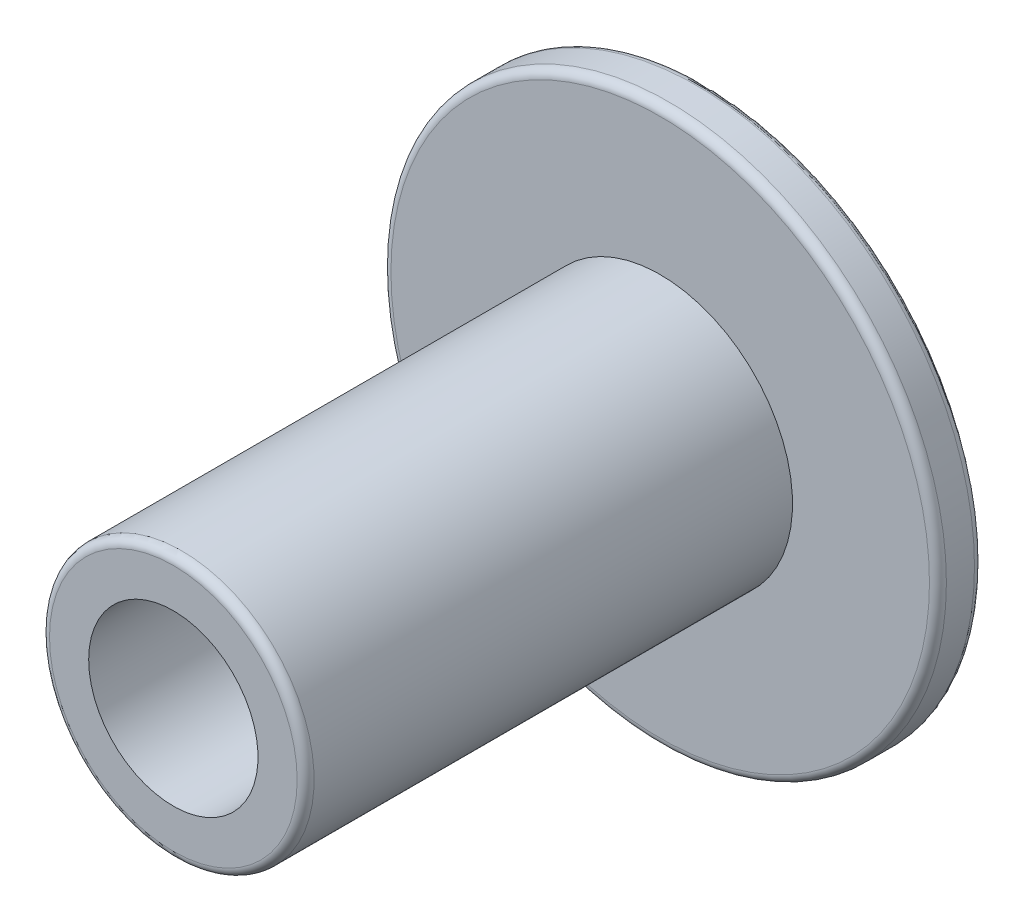
ISO-10303-21;
HEADER;
FILE_DESCRIPTION(('STEP AP214'),'2;1');
FILE_NAME('part.step','',(''),(''),'','','');
FILE_SCHEMA(('AUTOMOTIVE_DESIGN { 1 0 10303 214 1 1 1 1 }'));
ENDSEC;
DATA;
#1=APPLICATION_CONTEXT('core data for automotive mechanical design processes');
#2=APPLICATION_PROTOCOL_DEFINITION('international standard','automotive_design',2000,#1);
#3=PRODUCT_CONTEXT('',#1,'mechanical');
#4=PRODUCT('Part','Part','',(#3));
#5=PRODUCT_RELATED_PRODUCT_CATEGORY('part','',(#4));
#6=PRODUCT_DEFINITION_FORMATION('','',#4);
#7=PRODUCT_DEFINITION_CONTEXT('part definition',#1,'design');
#8=PRODUCT_DEFINITION('design','',#6,#7);
#9=PRODUCT_DEFINITION_SHAPE('','',#8);
#10=(LENGTH_UNIT() NAMED_UNIT(*) SI_UNIT(.MILLI.,.METRE.));
#11=(NAMED_UNIT(*) PLANE_ANGLE_UNIT() SI_UNIT($,.RADIAN.));
#12=(NAMED_UNIT(*) SI_UNIT($,.STERADIAN.) SOLID_ANGLE_UNIT());
#13=UNCERTAINTY_MEASURE_WITH_UNIT(LENGTH_MEASURE(1.E-05),#10,'distance_accuracy_value','');
#14=(GEOMETRIC_REPRESENTATION_CONTEXT(3) GLOBAL_UNCERTAINTY_ASSIGNED_CONTEXT((#13)) GLOBAL_UNIT_ASSIGNED_CONTEXT((#10,
#11,#12)) REPRESENTATION_CONTEXT('',''));
#15=CARTESIAN_POINT('',(0.,0.,0.));
#16=DIRECTION('',(0.,0.,1.));
#17=DIRECTION('',(1.,0.,0.));
#18=AXIS2_PLACEMENT_3D('',#15,#16,#17);
#19=CARTESIAN_POINT('',(4.55191440096314E-12,-6.10622663543836E-13,1.58750000000153));
#20=DIRECTION('',(0.,0.,-1.));
#21=DIRECTION('',(-1.,0.,0.));
#22=AXIS2_PLACEMENT_3D('',#19,#20,#21);
#23=TOROIDAL_SURFACE('',#22,2.24094461987932,1.5875);
#24=CARTESIAN_POINT('',(0.,0.,0.108811457693029));
#25=DIRECTION('',(0.,0.,1.));
#26=DIRECTION('',(1.,0.,0.));
#27=AXIS2_PLACEMENT_3D('',#24,#25,#26);
#28=CIRCLE('',#27,2.81855733169323);
#29=CARTESIAN_POINT('',(2.81855733169323,0.,0.108811457693037));
#30=VERTEX_POINT('',#29);
#31=EDGE_CURVE('E172',#30,#30,#28,.T.);
#32=ORIENTED_EDGE('',*,*,#31,.F.);
#33=EDGE_LOOP('',(#32));
#34=FACE_BOUND('',#33,.T.);
#35=CARTESIAN_POINT('',(4.55632059855483E-12,-6.07273953426408E-13,1.53219451015651E-12));
#36=DIRECTION('',(0.,0.,1.));
#37=DIRECTION('',(-1.,0.,0.));
#38=AXIS2_PLACEMENT_3D('',#35,#36,#37);
#39=CIRCLE('',#38,2.2409446198816);
#40=CARTESIAN_POINT('',(2.24094461988251,-5.23983614090785E-13,1.5465645340414E-12));
#41=VERTEX_POINT('',#40);
#42=CARTESIAN_POINT('',(-2.24094461987705,-3.52297822733429E-13,1.54384375825675E-12));
#43=VERTEX_POINT('',#42);
#44=EDGE_CURVE('E51',#41,#43,#39,.F.);
#45=ORIENTED_EDGE('',*,*,#44,.F.);
#46=CARTESIAN_POINT('',(4.55632059855483E-12,-6.07273953426408E-13,1.53219451015651E-12));
#47=DIRECTION('',(0.,0.,1.));
#48=DIRECTION('',(1.,2.08788882158213E-13,0.));
#49=AXIS2_PLACEMENT_3D('',#46,#47,#48);
#50=CIRCLE('',#49,2.24094461987705);
#51=EDGE_CURVE('E48',#43,#41,#50,.F.);
#52=ORIENTED_EDGE('',*,*,#51,.F.);
#53=EDGE_LOOP('',(#45,#52));
#54=FACE_BOUND('',#53,.T.);
#55=ADVANCED_FACE('F17',(#34,#54),#23,.T.);
#56=CARTESIAN_POINT('',(0.,0.,0.603441022263939));
#57=DIRECTION('',(0.,0.,1.));
#58=DIRECTION('',(1.,0.,0.));
#59=AXIS2_PLACEMENT_3D('',#56,#57,#58);
#60=CONICAL_SURFACE('',#59,4.08480901694475,1.19839788010476);
#61=ORIENTED_EDGE('',*,*,#31,.T.);
#62=EDGE_LOOP('',(#61));
#63=FACE_BOUND('',#62,.T.);
#64=CARTESIAN_POINT('',(3.55304201361089E-12,-2.83081917834214E-12,0.60344102225023));
#65=DIRECTION('',(0.,0.,1.));
#66=DIRECTION('',(1.,0.,0.));
#67=AXIS2_PLACEMENT_3D('',#64,#65,#66);
#68=CIRCLE('',#67,4.0848090169564);
#69=CARTESIAN_POINT('',(4.08480901695995,-2.85281416609798E-12,0.603441022250242));
#70=VERTEX_POINT('',#69);
#71=EDGE_CURVE('E160',#70,#70,#68,.T.);
#72=ORIENTED_EDGE('',*,*,#71,.F.);
#73=EDGE_LOOP('',(#72));
#74=FACE_BOUND('',#73,.T.);
#75=ADVANCED_FACE('F261',(#63,#74),#60,.T.);
#76=CARTESIAN_POINT('',(-1.26999999999694,-1.19348975147204E-12,1.56819002228303E-12));
#77=DIRECTION('',(0.,0.,-1.));
#78=DIRECTION('',(-1.,0.,0.));
#79=AXIS2_PLACEMENT_3D('',#76,#77,#78);
#80=PLANE('',#79);
#81=CARTESIAN_POINT('',(4.99177482609008E-12,-8.6474694213188E-13,0.));
#82=DIRECTION('',(0.,0.,-1.));
#83=DIRECTION('',(-1.,0.,0.));
#84=AXIS2_PLACEMENT_3D('',#81,#82,#83);
#85=CIRCLE('',#84,1.27);
#86=CARTESIAN_POINT('',(-1.26999999999501,-8.6474694213188E-13,0.));
#87=VERTEX_POINT('',#86);
#88=EDGE_CURVE('E145',#87,#87,#85,.F.);
#89=ORIENTED_EDGE('',*,*,#88,.T.);
#90=EDGE_LOOP('',(#89));
#91=FACE_BOUND('',#90,.T.);
#92=ORIENTED_EDGE('',*,*,#51,.T.);
#93=ORIENTED_EDGE('',*,*,#44,.T.);
#94=EDGE_LOOP('',(#92,#93));
#95=FACE_BOUND('',#94,.T.);
#96=ADVANCED_FACE('F136',(#91,#95),#80,.T.);
#97=CARTESIAN_POINT('',(3.5527136788005E-12,-2.83106871279415E-12,0.721736105630408));
#98=DIRECTION('',(0.,0.,1.));
#99=DIRECTION('',(1.,0.,0.));
#100=AXIS2_PLACEMENT_3D('',#97,#98,#99);
#101=TOROIDAL_SURFACE('',#100,4.0386,0.127);
#102=ORIENTED_EDGE('',*,*,#71,.T.);
#103=EDGE_LOOP('',(#102));
#104=FACE_BOUND('',#103,.T.);
#105=CARTESIAN_POINT('',(4.9897716060016E-12,-8.66269389375368E-13,0.721736105630408));
#106=DIRECTION('',(0.,0.,-1.));
#107=DIRECTION('',(-1.,0.,0.));
#108=AXIS2_PLACEMENT_3D('',#105,#106,#107);
#109=CIRCLE('',#108,4.16560000000001);
#110=CARTESIAN_POINT('',(-4.16559999999502,-8.66269389375368E-13,0.721736105630396));
#111=VERTEX_POINT('',#110);
#112=EDGE_CURVE('E141',#111,#111,#109,.F.);
#113=ORIENTED_EDGE('',*,*,#112,.F.);
#114=EDGE_LOOP('',(#113));
#115=FACE_BOUND('',#114,.T.);
#116=ADVANCED_FACE('F132',(#104,#115),#101,.T.);
#117=CARTESIAN_POINT('',(5.10702591327572E-12,-7.77156117237609E-13,-41.52358061571));
#118=DIRECTION('',(0.,0.,-1.));
#119=DIRECTION('',(-1.,0.,0.));
#120=AXIS2_PLACEMENT_3D('',#117,#118,#119);
#121=CYLINDRICAL_SURFACE('',#120,1.27);
#122=ORIENTED_EDGE('',*,*,#88,.F.);
#123=EDGE_LOOP('',(#122));
#124=FACE_BOUND('',#123,.T.);
#125=CARTESIAN_POINT('',(4.96798135909496E-12,-8.82829976765994E-13,8.57250000000193));
#126=DIRECTION('',(0.,0.,-1.));
#127=DIRECTION('',(-1.,0.,0.));
#128=AXIS2_PLACEMENT_3D('',#125,#126,#127);
#129=CIRCLE('',#128,1.27);
#130=CARTESIAN_POINT('',(-1.26999999999504,-8.82829976765994E-13,8.57250000000193));
#131=VERTEX_POINT('',#130);
#132=EDGE_CURVE('E144',#131,#131,#129,.T.);
#133=ORIENTED_EDGE('',*,*,#132,.F.);
#134=EDGE_LOOP('',(#133));
#135=FACE_BOUND('',#134,.T.);
#136=ADVANCED_FACE('F128',(#124,#135),#121,.F.);
#137=CARTESIAN_POINT('',(5.10702591327572E-12,-7.77156117237609E-13,-41.52358061571));
#138=DIRECTION('',(0.,0.,-1.));
#139=DIRECTION('',(-1.,0.,0.));
#140=AXIS2_PLACEMENT_3D('',#137,#138,#139);
#141=CYLINDRICAL_SURFACE('',#140,4.16560000000001);
#142=CARTESIAN_POINT('',(2.66453525910038E-12,-2.99760216648792E-12,1.14300000000254));
#143=DIRECTION('',(0.,0.,1.));
#144=DIRECTION('',(1.,0.,0.));
#145=AXIS2_PLACEMENT_3D('',#142,#143,#144);
#146=CIRCLE('',#145,4.1656);
#147=CARTESIAN_POINT('',(4.16560000000266,-3.02003217989011E-12,1.14300000000256));
#148=VERTEX_POINT('',#147);
#149=EDGE_CURVE('E66',#148,#148,#146,.T.);
#150=ORIENTED_EDGE('',*,*,#149,.F.);
#151=EDGE_LOOP('',(#150));
#152=FACE_BOUND('',#151,.T.);
#153=ORIENTED_EDGE('',*,*,#112,.T.);
#154=EDGE_LOOP('',(#153));
#155=FACE_BOUND('',#154,.T.);
#156=ADVANCED_FACE('F123',(#152,#155),#141,.T.);
#157=CARTESIAN_POINT('',(-1.9843749999966,-2.94209101525666E-12,8.57250000000163));
#158=DIRECTION('',(0.,0.,1.));
#159=DIRECTION('',(1.,0.,0.));
#160=AXIS2_PLACEMENT_3D('',#157,#158,#159);
#161=PLANE('',#160);
#162=ORIENTED_EDGE('',*,*,#132,.T.);
#163=EDGE_LOOP('',(#162));
#164=FACE_BOUND('',#163,.T.);
#165=CARTESIAN_POINT('',(4.77360651008084E-12,-2.66480315590977E-12,8.57250000000213));
#166=DIRECTION('',(0.,0.,-1.));
#167=DIRECTION('',(-1.,9.07008142344974E-13,0.));
#168=AXIS2_PLACEMENT_3D('',#165,#166,#167);
#169=CIRCLE('',#168,1.85737500000083);
#170=CARTESIAN_POINT('',(-1.85737499999564,-1.98444584004809E-12,8.57250000000193));
#171=VERTEX_POINT('',#170);
#172=CARTESIAN_POINT('',(1.85737500000453,-2.39714142840798E-12,8.57250000000193));
#173=VERTEX_POINT('',#172);
#174=EDGE_CURVE('E64',#171,#173,#169,.T.);
#175=ORIENTED_EDGE('',*,*,#174,.F.);
#176=CARTESIAN_POINT('',(4.77360651008084E-12,-2.66480315590977E-12,8.57250000000213));
#177=DIRECTION('',(0.,0.,-1.));
#178=DIRECTION('',(1.,0.,0.));
#179=AXIS2_PLACEMENT_3D('',#176,#177,#178);
#180=CIRCLE('',#179,1.85737499999917);
#181=EDGE_CURVE('E58',#173,#171,#180,.T.);
#182=ORIENTED_EDGE('',*,*,#181,.F.);
#183=EDGE_LOOP('',(#175,#182));
#184=FACE_BOUND('',#183,.T.);
#185=ADVANCED_FACE('F63',(#164,#184),#161,.T.);
#186=CARTESIAN_POINT('',(2.66453525910038E-12,-2.99760216648792E-12,1.14300000000254));
#187=DIRECTION('',(0.,0.,1.));
#188=DIRECTION('',(1.,0.,0.));
#189=AXIS2_PLACEMENT_3D('',#186,#187,#188);
#190=TOROIDAL_SURFACE('',#189,4.0386,0.127);
#191=ORIENTED_EDGE('',*,*,#149,.T.);
#192=EDGE_LOOP('',(#191));
#193=FACE_BOUND('',#192,.T.);
#194=CARTESIAN_POINT('',(2.66418276329304E-12,-2.99787006329732E-12,1.27000000000254));
#195=DIRECTION('',(0.,0.,-1.));
#196=DIRECTION('',(1.,0.,0.));
#197=AXIS2_PLACEMENT_3D('',#194,#195,#196);
#198=CIRCLE('',#197,4.03859999999998);
#199=CARTESIAN_POINT('',(-4.03859999999735,-2.56221375103142E-12,1.27000000000235));
#200=VERTEX_POINT('',#199);
#201=CARTESIAN_POINT('',(4.03860000000264,-2.44219310329865E-12,1.27000000000236));
#202=VERTEX_POINT('',#201);
#203=EDGE_CURVE('E37',#200,#202,#198,.F.);
#204=ORIENTED_EDGE('',*,*,#203,.F.);
#205=CARTESIAN_POINT('',(2.66418276329304E-12,-2.99787006329732E-12,1.27000000000254));
#206=DIRECTION('',(0.,0.,-1.));
#207=DIRECTION('',(-1.,5.17097816096619E-13,0.));
#208=AXIS2_PLACEMENT_3D('',#205,#206,#207);
#209=CIRCLE('',#208,4.03860000000003);
#210=EDGE_CURVE('E72',#202,#200,#209,.F.);
#211=ORIENTED_EDGE('',*,*,#210,.F.);
#212=EDGE_LOOP('',(#204,#211));
#213=FACE_BOUND('',#212,.T.);
#214=ADVANCED_FACE('F93',(#193,#213),#190,.T.);
#215=CARTESIAN_POINT('',(4.77395900588817E-12,-2.66453525910038E-12,8.44550000000213));
#216=DIRECTION('',(0.,0.,1.));
#217=DIRECTION('',(1.,0.,0.));
#218=AXIS2_PLACEMENT_3D('',#215,#216,#217);
#219=TOROIDAL_SURFACE('',#218,1.857375,0.127);
#220=ORIENTED_EDGE('',*,*,#181,.T.);
#221=ORIENTED_EDGE('',*,*,#174,.T.);
#222=EDGE_LOOP('',(#220,#221));
#223=FACE_BOUND('',#222,.T.);
#224=CARTESIAN_POINT('',(4.9683338549023E-12,-8.825620799566E-13,8.44550000000213));
#225=DIRECTION('',(0.,0.,-1.));
#226=DIRECTION('',(-1.,0.,0.));
#227=AXIS2_PLACEMENT_3D('',#224,#225,#226);
#228=CIRCLE('',#227,1.98437500000001);
#229=CARTESIAN_POINT('',(-1.98437499999504,-8.825620799566E-13,8.44550000000213));
#230=VERTEX_POINT('',#229);
#231=EDGE_CURVE('E29',#230,#230,#228,.T.);
#232=ORIENTED_EDGE('',*,*,#231,.F.);
#233=EDGE_LOOP('',(#232));
#234=FACE_BOUND('',#233,.T.);
#235=ADVANCED_FACE('F70',(#223,#234),#219,.T.);
#236=CARTESIAN_POINT('',(-4.16559999999611,-5.55111512312578E-13,1.27000000000208));
#237=DIRECTION('',(0.,0.,1.));
#238=DIRECTION('',(1.,0.,0.));
#239=AXIS2_PLACEMENT_3D('',#236,#237,#238);
#240=PLANE('',#239);
#241=CARTESIAN_POINT('',(4.98824986801673E-12,-8.67425910225827E-13,1.27000000000221));
#242=DIRECTION('',(0.,0.,-1.));
#243=DIRECTION('',(-1.,0.,0.));
#244=AXIS2_PLACEMENT_3D('',#241,#242,#243);
#245=CIRCLE('',#244,1.98437500000001);
#246=CARTESIAN_POINT('',(-1.98437499999502,-8.67425910225827E-13,1.27000000000221));
#247=VERTEX_POINT('',#246);
#248=EDGE_CURVE('E11',#247,#247,#245,.F.);
#249=ORIENTED_EDGE('',*,*,#248,.F.);
#250=EDGE_LOOP('',(#249));
#251=FACE_BOUND('',#250,.T.);
#252=ORIENTED_EDGE('',*,*,#210,.T.);
#253=ORIENTED_EDGE('',*,*,#203,.T.);
#254=EDGE_LOOP('',(#252,#253));
#255=FACE_BOUND('',#254,.T.);
#256=ADVANCED_FACE('F92',(#251,#255),#240,.T.);
#257=CARTESIAN_POINT('',(5.10702591327572E-12,-7.77156117237609E-13,-41.52358061571));
#258=DIRECTION('',(0.,0.,-1.));
#259=DIRECTION('',(-1.,0.,0.));
#260=AXIS2_PLACEMENT_3D('',#257,#258,#259);
#261=CYLINDRICAL_SURFACE('',#260,1.98437500000001);
#262=ORIENTED_EDGE('',*,*,#248,.T.);
#263=EDGE_LOOP('',(#262));
#264=FACE_BOUND('',#263,.T.);
#265=ORIENTED_EDGE('',*,*,#231,.T.);
#266=EDGE_LOOP('',(#265));
#267=FACE_BOUND('',#266,.T.);
#268=ADVANCED_FACE('F216',(#264,#267),#261,.T.);
#269=CLOSED_SHELL('',(#55,#75,#96,#116,#136,#156,#185,#214,#235,#256,#268));
#270=MANIFOLD_SOLID_BREP('B1',#269);
#271=ADVANCED_BREP_SHAPE_REPRESENTATION('',(#18,#270),#14);
#272=SHAPE_DEFINITION_REPRESENTATION(#9,#271);
ENDSEC;
END-ISO-10303-21;
